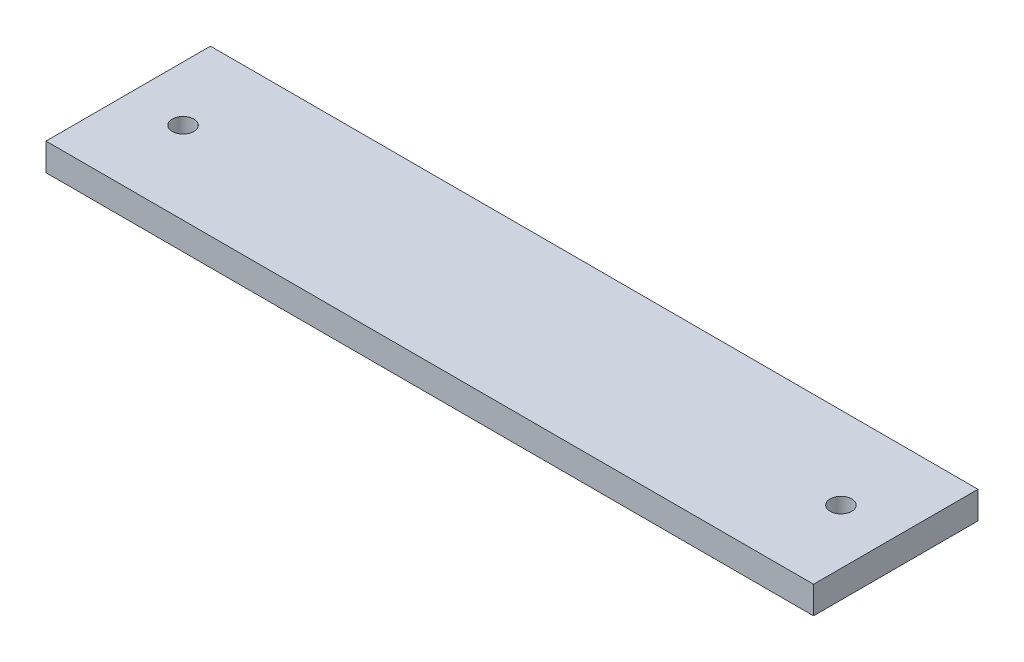
ISO-10303-21;
HEADER;
FILE_DESCRIPTION(('STEP AP214'),'2;1');
FILE_NAME('part.step','',(''),(''),'','','');
FILE_SCHEMA(('AUTOMOTIVE_DESIGN { 1 0 10303 214 1 1 1 1 }'));
ENDSEC;
DATA;
#1=APPLICATION_CONTEXT('core data for automotive mechanical design processes');
#2=APPLICATION_PROTOCOL_DEFINITION('international standard','automotive_design',2000,#1);
#3=PRODUCT_CONTEXT('',#1,'mechanical');
#4=PRODUCT('Part','Part','',(#3));
#5=PRODUCT_RELATED_PRODUCT_CATEGORY('part','',(#4));
#6=PRODUCT_DEFINITION_FORMATION('','',#4);
#7=PRODUCT_DEFINITION_CONTEXT('part definition',#1,'design');
#8=PRODUCT_DEFINITION('design','',#6,#7);
#9=PRODUCT_DEFINITION_SHAPE('','',#8);
#10=(LENGTH_UNIT() NAMED_UNIT(*) SI_UNIT(.MILLI.,.METRE.));
#11=(NAMED_UNIT(*) PLANE_ANGLE_UNIT() SI_UNIT($,.RADIAN.));
#12=(NAMED_UNIT(*) SI_UNIT($,.STERADIAN.) SOLID_ANGLE_UNIT());
#13=UNCERTAINTY_MEASURE_WITH_UNIT(LENGTH_MEASURE(1.E-05),#10,'distance_accuracy_value','');
#14=(GEOMETRIC_REPRESENTATION_CONTEXT(3) GLOBAL_UNCERTAINTY_ASSIGNED_CONTEXT((#13)) GLOBAL_UNIT_ASSIGNED_CONTEXT((#10,
#11,#12)) REPRESENTATION_CONTEXT('',''));
#15=CARTESIAN_POINT('',(0.,0.,0.));
#16=DIRECTION('',(0.,0.,1.));
#17=DIRECTION('',(1.,0.,0.));
#18=AXIS2_PLACEMENT_3D('',#15,#16,#17);
#19=CARTESIAN_POINT('',(0.,6.35,0.));
#20=DIRECTION('',(0.,0.,-1.));
#21=DIRECTION('',(-1.,0.,0.));
#22=AXIS2_PLACEMENT_3D('',#19,#20,#21);
#23=PLANE('',#22);
#24=DIRECTION('',(1.,0.,0.));
#25=VECTOR('',#24,1.);
#26=CARTESIAN_POINT('',(0.,0.,0.));
#27=LINE('',#26,#25);
#28=CARTESIAN_POINT('',(0.,0.,0.));
#29=VERTEX_POINT('',#28);
#30=CARTESIAN_POINT('',(177.8,0.,0.));
#31=VERTEX_POINT('',#30);
#32=EDGE_CURVE('E118',#29,#31,#27,.T.);
#33=ORIENTED_EDGE('',*,*,#32,.T.);
#34=DIRECTION('',(0.,-1.,0.));
#35=VECTOR('',#34,1.);
#36=CARTESIAN_POINT('',(177.8,6.35,0.));
#37=LINE('',#36,#35);
#38=CARTESIAN_POINT('',(177.8,6.35,0.));
#39=VERTEX_POINT('',#38);
#40=EDGE_CURVE('E11',#39,#31,#37,.T.);
#41=ORIENTED_EDGE('',*,*,#40,.F.);
#42=DIRECTION('',(1.,0.,0.));
#43=VECTOR('',#42,1.);
#44=CARTESIAN_POINT('',(0.,6.35,0.));
#45=LINE('',#44,#43);
#46=CARTESIAN_POINT('',(0.,6.35,0.));
#47=VERTEX_POINT('',#46);
#48=EDGE_CURVE('E92',#47,#39,#45,.T.);
#49=ORIENTED_EDGE('',*,*,#48,.F.);
#50=DIRECTION('',(0.,-1.,0.));
#51=VECTOR('',#50,1.);
#52=CARTESIAN_POINT('',(0.,6.35,0.));
#53=LINE('',#52,#51);
#54=EDGE_CURVE('E59',#47,#29,#53,.T.);
#55=ORIENTED_EDGE('',*,*,#54,.T.);
#56=EDGE_LOOP('',(#33,#41,#49,#55));
#57=FACE_BOUND('',#56,.T.);
#58=ADVANCED_FACE('F41',(#57),#23,.F.);
#59=CARTESIAN_POINT('',(177.8,6.35,0.));
#60=DIRECTION('',(-1.,0.,0.));
#61=DIRECTION('',(0.,0.,1.));
#62=AXIS2_PLACEMENT_3D('',#59,#60,#61);
#63=PLANE('',#62);
#64=DIRECTION('',(0.,0.,-1.));
#65=VECTOR('',#64,1.);
#66=CARTESIAN_POINT('',(177.8,0.,0.));
#67=LINE('',#66,#65);
#68=CARTESIAN_POINT('',(177.8,0.,-38.1));
#69=VERTEX_POINT('',#68);
#70=EDGE_CURVE('E98',#31,#69,#67,.T.);
#71=ORIENTED_EDGE('',*,*,#70,.T.);
#72=DIRECTION('',(0.,-1.,0.));
#73=VECTOR('',#72,1.);
#74=CARTESIAN_POINT('',(177.8,6.35,-38.1));
#75=LINE('',#74,#73);
#76=CARTESIAN_POINT('',(177.8,6.35,-38.1));
#77=VERTEX_POINT('',#76);
#78=EDGE_CURVE('E51',#77,#69,#75,.T.);
#79=ORIENTED_EDGE('',*,*,#78,.F.);
#80=DIRECTION('',(0.,0.,-1.));
#81=VECTOR('',#80,1.);
#82=CARTESIAN_POINT('',(177.8,6.35,0.));
#83=LINE('',#82,#81);
#84=EDGE_CURVE('E84',#39,#77,#83,.T.);
#85=ORIENTED_EDGE('',*,*,#84,.F.);
#86=ORIENTED_EDGE('',*,*,#40,.T.);
#87=EDGE_LOOP('',(#71,#79,#85,#86));
#88=FACE_BOUND('',#87,.T.);
#89=ADVANCED_FACE('F97',(#88),#63,.F.);
#90=CARTESIAN_POINT('',(0.,6.35,-38.0999999999999));
#91=DIRECTION('',(0.,0.,-1.));
#92=DIRECTION('',(-1.,0.,0.));
#93=AXIS2_PLACEMENT_3D('',#90,#91,#92);
#94=PLANE('',#93);
#95=DIRECTION('',(1.,0.,0.));
#96=VECTOR('',#95,1.);
#97=CARTESIAN_POINT('',(0.,0.,-38.0999999999999));
#98=LINE('',#97,#96);
#99=CARTESIAN_POINT('',(0.,0.,-38.0999999999999));
#100=VERTEX_POINT('',#99);
#101=EDGE_CURVE('E123',#100,#69,#98,.T.);
#102=ORIENTED_EDGE('',*,*,#101,.F.);
#103=DIRECTION('',(0.,-1.,0.));
#104=VECTOR('',#103,1.);
#105=CARTESIAN_POINT('',(0.,6.35,-38.0999999999999));
#106=LINE('',#105,#104);
#107=CARTESIAN_POINT('',(0.,6.35,-38.0999999999999));
#108=VERTEX_POINT('',#107);
#109=EDGE_CURVE('E73',#108,#100,#106,.T.);
#110=ORIENTED_EDGE('',*,*,#109,.F.);
#111=DIRECTION('',(1.,0.,0.));
#112=VECTOR('',#111,1.);
#113=CARTESIAN_POINT('',(0.,6.35,-38.0999999999999));
#114=LINE('',#113,#112);
#115=EDGE_CURVE('E91',#108,#77,#114,.T.);
#116=ORIENTED_EDGE('',*,*,#115,.T.);
#117=ORIENTED_EDGE('',*,*,#78,.T.);
#118=EDGE_LOOP('',(#102,#110,#116,#117));
#119=FACE_BOUND('',#118,.T.);
#120=ADVANCED_FACE('F102',(#119),#94,.T.);
#121=CARTESIAN_POINT('',(12.7,6.35,-19.05));
#122=DIRECTION('',(0.,-1.,0.));
#123=DIRECTION('',(0.,0.,-1.));
#124=AXIS2_PLACEMENT_3D('',#121,#122,#123);
#125=CYLINDRICAL_SURFACE('',#124,2.5);
#126=CARTESIAN_POINT('',(12.7,6.35,-19.05));
#127=DIRECTION('',(0.,1.,0.));
#128=DIRECTION('',(0.,0.,1.));
#129=AXIS2_PLACEMENT_3D('',#126,#127,#128);
#130=CIRCLE('',#129,2.5);
#131=CARTESIAN_POINT('',(12.7,6.35,-16.55));
#132=VERTEX_POINT('',#131);
#133=EDGE_CURVE('E137',#132,#132,#130,.T.);
#134=ORIENTED_EDGE('',*,*,#133,.T.);
#135=EDGE_LOOP('',(#134));
#136=FACE_BOUND('',#135,.T.);
#137=CARTESIAN_POINT('',(12.7,0.,-19.05));
#138=DIRECTION('',(0.,1.,0.));
#139=DIRECTION('',(0.,0.,1.));
#140=AXIS2_PLACEMENT_3D('',#137,#138,#139);
#141=CIRCLE('',#140,2.5);
#142=CARTESIAN_POINT('',(12.7,0.,-16.55));
#143=VERTEX_POINT('',#142);
#144=EDGE_CURVE('E114',#143,#143,#141,.T.);
#145=ORIENTED_EDGE('',*,*,#144,.F.);
#146=EDGE_LOOP('',(#145));
#147=FACE_BOUND('',#146,.T.);
#148=ADVANCED_FACE('F147',(#136,#147),#125,.F.);
#149=CARTESIAN_POINT('',(165.1,6.35,-19.05));
#150=DIRECTION('',(0.,-1.,0.));
#151=DIRECTION('',(0.,0.,-1.));
#152=AXIS2_PLACEMENT_3D('',#149,#150,#151);
#153=CYLINDRICAL_SURFACE('',#152,2.5);
#154=CARTESIAN_POINT('',(165.1,6.35,-19.05));
#155=DIRECTION('',(0.,1.,0.));
#156=DIRECTION('',(0.,0.,1.));
#157=AXIS2_PLACEMENT_3D('',#154,#155,#156);
#158=CIRCLE('',#157,2.5);
#159=CARTESIAN_POINT('',(165.1,6.35,-16.55));
#160=VERTEX_POINT('',#159);
#161=EDGE_CURVE('E130',#160,#160,#158,.T.);
#162=ORIENTED_EDGE('',*,*,#161,.T.);
#163=EDGE_LOOP('',(#162));
#164=FACE_BOUND('',#163,.T.);
#165=CARTESIAN_POINT('',(165.1,0.,-19.05));
#166=DIRECTION('',(0.,1.,0.));
#167=DIRECTION('',(0.,0.,1.));
#168=AXIS2_PLACEMENT_3D('',#165,#166,#167);
#169=CIRCLE('',#168,2.5);
#170=CARTESIAN_POINT('',(165.1,0.,-16.55));
#171=VERTEX_POINT('',#170);
#172=EDGE_CURVE('E110',#171,#171,#169,.T.);
#173=ORIENTED_EDGE('',*,*,#172,.F.);
#174=EDGE_LOOP('',(#173));
#175=FACE_BOUND('',#174,.T.);
#176=ADVANCED_FACE('F43',(#164,#175),#153,.F.);
#177=CARTESIAN_POINT('',(0.,6.35,0.));
#178=DIRECTION('',(-1.,0.,0.));
#179=DIRECTION('',(0.,0.,1.));
#180=AXIS2_PLACEMENT_3D('',#177,#178,#179);
#181=PLANE('',#180);
#182=DIRECTION('',(0.,0.,-1.));
#183=VECTOR('',#182,1.);
#184=CARTESIAN_POINT('',(0.,0.,0.));
#185=LINE('',#184,#183);
#186=EDGE_CURVE('E126',#29,#100,#185,.T.);
#187=ORIENTED_EDGE('',*,*,#186,.F.);
#188=ORIENTED_EDGE('',*,*,#54,.F.);
#189=DIRECTION('',(0.,0.,-1.));
#190=VECTOR('',#189,1.);
#191=CARTESIAN_POINT('',(0.,6.35,0.));
#192=LINE('',#191,#190);
#193=EDGE_CURVE('E104',#47,#108,#192,.T.);
#194=ORIENTED_EDGE('',*,*,#193,.T.);
#195=ORIENTED_EDGE('',*,*,#109,.T.);
#196=EDGE_LOOP('',(#187,#188,#194,#195));
#197=FACE_BOUND('',#196,.T.);
#198=ADVANCED_FACE('F152',(#197),#181,.T.);
#199=CARTESIAN_POINT('',(0.,6.35,0.));
#200=DIRECTION('',(0.,1.,0.));
#201=DIRECTION('',(0.,0.,1.));
#202=AXIS2_PLACEMENT_3D('',#199,#200,#201);
#203=PLANE('',#202);
#204=ORIENTED_EDGE('',*,*,#161,.F.);
#205=EDGE_LOOP('',(#204));
#206=FACE_BOUND('',#205,.T.);
#207=ORIENTED_EDGE('',*,*,#133,.F.);
#208=EDGE_LOOP('',(#207));
#209=FACE_BOUND('',#208,.T.);
#210=ORIENTED_EDGE('',*,*,#48,.T.);
#211=ORIENTED_EDGE('',*,*,#84,.T.);
#212=ORIENTED_EDGE('',*,*,#115,.F.);
#213=ORIENTED_EDGE('',*,*,#193,.F.);
#214=EDGE_LOOP('',(#210,#211,#212,#213));
#215=FACE_BOUND('',#214,.T.);
#216=ADVANCED_FACE('F88',(#206,#209,#215),#203,.T.);
#217=CARTESIAN_POINT('',(0.,0.,0.));
#218=DIRECTION('',(0.,1.,0.));
#219=DIRECTION('',(0.,0.,1.));
#220=AXIS2_PLACEMENT_3D('',#217,#218,#219);
#221=PLANE('',#220);
#222=ORIENTED_EDGE('',*,*,#172,.T.);
#223=EDGE_LOOP('',(#222));
#224=FACE_BOUND('',#223,.T.);
#225=ORIENTED_EDGE('',*,*,#144,.T.);
#226=EDGE_LOOP('',(#225));
#227=FACE_BOUND('',#226,.T.);
#228=ORIENTED_EDGE('',*,*,#32,.F.);
#229=ORIENTED_EDGE('',*,*,#186,.T.);
#230=ORIENTED_EDGE('',*,*,#101,.T.);
#231=ORIENTED_EDGE('',*,*,#70,.F.);
#232=EDGE_LOOP('',(#228,#229,#230,#231));
#233=FACE_BOUND('',#232,.T.);
#234=ADVANCED_FACE('F151',(#224,#227,#233),#221,.F.);
#235=CLOSED_SHELL('',(#58,#89,#120,#148,#176,#198,#216,#234));
#236=MANIFOLD_SOLID_BREP('B2',#235);
#237=ADVANCED_BREP_SHAPE_REPRESENTATION('',(#18,#236),#14);
#238=SHAPE_DEFINITION_REPRESENTATION(#9,#237);
ENDSEC;
END-ISO-10303-21;
